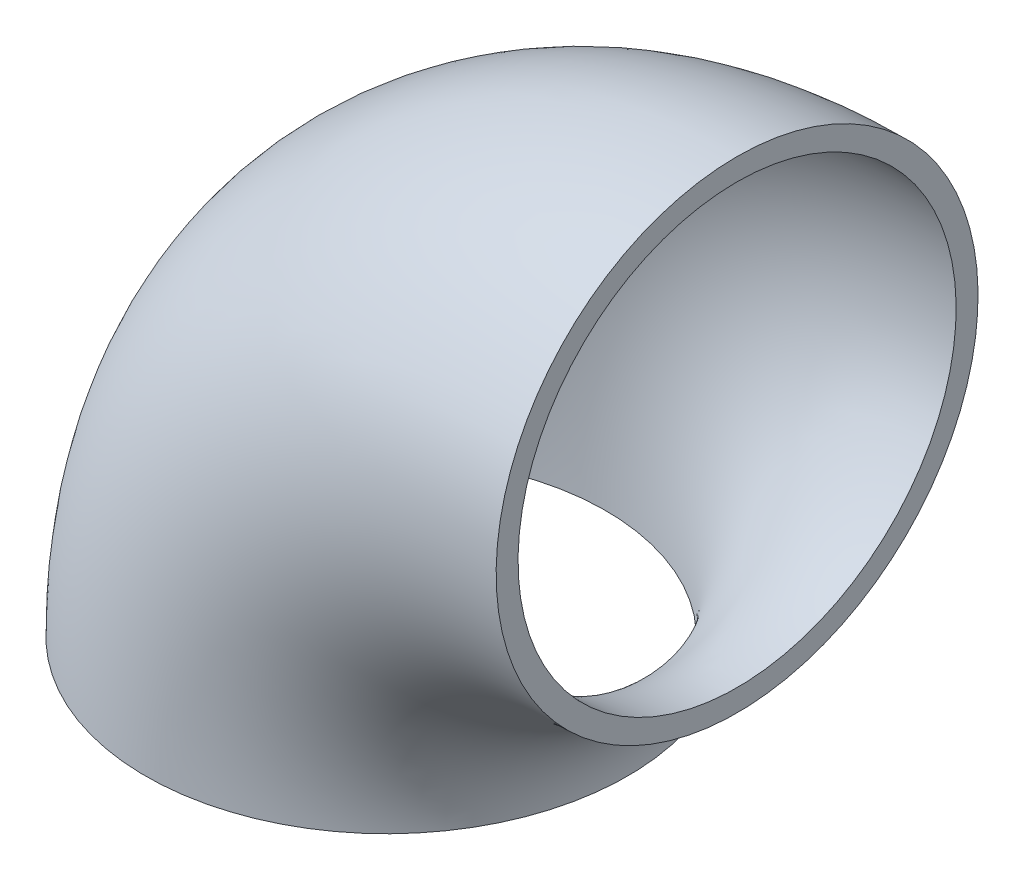
ISO-10303-21;
HEADER;
FILE_DESCRIPTION(('STEP AP214'),'2;1');
FILE_NAME('part.step','',(''),(''),'','','');
FILE_SCHEMA(('AUTOMOTIVE_DESIGN { 1 0 10303 214 1 1 1 1 }'));
ENDSEC;
DATA;
#1=APPLICATION_CONTEXT('core data for automotive mechanical design processes');
#2=APPLICATION_PROTOCOL_DEFINITION('international standard','automotive_design',2000,#1);
#3=PRODUCT_CONTEXT('',#1,'mechanical');
#4=PRODUCT('Part','Part','',(#3));
#5=PRODUCT_RELATED_PRODUCT_CATEGORY('part','',(#4));
#6=PRODUCT_DEFINITION_FORMATION('','',#4);
#7=PRODUCT_DEFINITION_CONTEXT('part definition',#1,'design');
#8=PRODUCT_DEFINITION('design','',#6,#7);
#9=PRODUCT_DEFINITION_SHAPE('','',#8);
#10=(LENGTH_UNIT() NAMED_UNIT(*) SI_UNIT(.MILLI.,.METRE.));
#11=(NAMED_UNIT(*) PLANE_ANGLE_UNIT() SI_UNIT($,.RADIAN.));
#12=(NAMED_UNIT(*) SI_UNIT($,.STERADIAN.) SOLID_ANGLE_UNIT());
#13=UNCERTAINTY_MEASURE_WITH_UNIT(LENGTH_MEASURE(1.E-05),#10,'distance_accuracy_value','');
#14=(GEOMETRIC_REPRESENTATION_CONTEXT(3) GLOBAL_UNCERTAINTY_ASSIGNED_CONTEXT((#13)) GLOBAL_UNIT_ASSIGNED_CONTEXT((#10,
#11,#12)) REPRESENTATION_CONTEXT('',''));
#15=CARTESIAN_POINT('',(0.,0.,0.));
#16=DIRECTION('',(0.,0.,1.));
#17=DIRECTION('',(1.,0.,0.));
#18=AXIS2_PLACEMENT_3D('',#15,#16,#17);
#19=CARTESIAN_POINT('',(40.,0.,0.));
#20=DIRECTION('',(0.,0.,1.));
#21=DIRECTION('',(1.,0.,0.));
#22=AXIS2_PLACEMENT_3D('',#19,#20,#21);
#23=TOROIDAL_SURFACE('',#22,40.,27.5);
#24=CARTESIAN_POINT('',(40.,40.,0.));
#25=DIRECTION('',(1.,0.,0.));
#26=DIRECTION('',(0.,0.,1.));
#27=AXIS2_PLACEMENT_3D('',#24,#25,#26);
#28=CIRCLE('',#27,27.5);
#29=CARTESIAN_POINT('',(40.,67.5,0.));
#30=VERTEX_POINT('',#29);
#31=EDGE_CURVE('E40',#30,#30,#28,.T.);
#32=CARTESIAN_POINT('',(0.,0.,0.));
#33=DIRECTION('',(0.,1.,0.));
#34=DIRECTION('',(0.,0.,1.));
#35=AXIS2_PLACEMENT_3D('',#32,#33,#34);
#36=CIRCLE('',#35,27.5);
#37=CARTESIAN_POINT('',(-27.5,0.,0.));
#38=VERTEX_POINT('',#37);
#39=EDGE_CURVE('E51',#38,#38,#36,.T.);
#40=CARTESIAN_POINT('',(40.,0.,0.));
#41=DIRECTION('',(0.,0.,1.));
#42=DIRECTION('',(1.,0.,0.));
#43=AXIS2_PLACEMENT_3D('',#40,#41,#42);
#44=CIRCLE('',#43,67.5);
#45=EDGE_CURVE('',#30,#38,#44,.T.);
#46=ORIENTED_EDGE('',*,*,#31,.F.);
#47=ORIENTED_EDGE('',*,*,#39,.T.);
#48=ORIENTED_EDGE('',*,*,#45,.T.);
#49=ORIENTED_EDGE('',*,*,#45,.F.);
#50=EDGE_LOOP('',(#46,#48,#47,#49));
#51=FACE_BOUND('',#50,.T.);
#52=ADVANCED_FACE('F37',(#51),#23,.T.);
#53=CARTESIAN_POINT('',(40.,40.,0.));
#54=DIRECTION('',(1.,0.,0.));
#55=DIRECTION('',(0.,0.,1.));
#56=AXIS2_PLACEMENT_3D('',#53,#54,#55);
#57=PLANE('',#56);
#58=CARTESIAN_POINT('',(40.,40.,0.));
#59=DIRECTION('',(1.,0.,0.));
#60=DIRECTION('',(0.,0.,1.));
#61=AXIS2_PLACEMENT_3D('',#58,#59,#60);
#62=CIRCLE('',#61,25.);
#63=CARTESIAN_POINT('',(40.,65.,0.));
#64=VERTEX_POINT('',#63);
#65=EDGE_CURVE('E45',#64,#64,#62,.F.);
#66=ORIENTED_EDGE('',*,*,#65,.T.);
#67=EDGE_LOOP('',(#66));
#68=FACE_BOUND('',#67,.T.);
#69=ORIENTED_EDGE('',*,*,#31,.T.);
#70=EDGE_LOOP('',(#69));
#71=FACE_BOUND('',#70,.T.);
#72=ADVANCED_FACE('F61',(#68,#71),#57,.T.);
#73=CARTESIAN_POINT('',(0.,0.,0.));
#74=DIRECTION('',(0.,1.,0.));
#75=DIRECTION('',(0.,0.,1.));
#76=AXIS2_PLACEMENT_3D('',#73,#74,#75);
#77=PLANE('',#76);
#78=CARTESIAN_POINT('',(0.,0.,0.));
#79=DIRECTION('',(0.,1.,0.));
#80=DIRECTION('',(0.,0.,1.));
#81=AXIS2_PLACEMENT_3D('',#78,#79,#80);
#82=CIRCLE('',#81,25.);
#83=CARTESIAN_POINT('',(-25.,0.,0.));
#84=VERTEX_POINT('',#83);
#85=EDGE_CURVE('E10',#84,#84,#82,.F.);
#86=ORIENTED_EDGE('',*,*,#85,.F.);
#87=EDGE_LOOP('',(#86));
#88=FACE_BOUND('',#87,.T.);
#89=ORIENTED_EDGE('',*,*,#39,.F.);
#90=EDGE_LOOP('',(#89));
#91=FACE_BOUND('',#90,.T.);
#92=ADVANCED_FACE('F67',(#88,#91),#77,.F.);
#93=CARTESIAN_POINT('',(40.,0.,0.));
#94=DIRECTION('',(0.,0.,1.));
#95=DIRECTION('',(1.,0.,0.));
#96=AXIS2_PLACEMENT_3D('',#93,#94,#95);
#97=TOROIDAL_SURFACE('',#96,40.,25.);
#98=CARTESIAN_POINT('',(40.,0.,0.));
#99=DIRECTION('',(0.,0.,1.));
#100=DIRECTION('',(1.,0.,0.));
#101=AXIS2_PLACEMENT_3D('',#98,#99,#100);
#102=CIRCLE('',#101,65.);
#103=EDGE_CURVE('',#64,#84,#102,.T.);
#104=ORIENTED_EDGE('',*,*,#65,.F.);
#105=ORIENTED_EDGE('',*,*,#85,.T.);
#106=ORIENTED_EDGE('',*,*,#103,.T.);
#107=ORIENTED_EDGE('',*,*,#103,.F.);
#108=EDGE_LOOP('',(#104,#106,#105,#107));
#109=FACE_BOUND('',#108,.T.);
#110=ADVANCED_FACE('F69',(#109),#97,.F.);
#111=CLOSED_SHELL('',(#52,#72,#92,#110));
#112=MANIFOLD_SOLID_BREP('B2',#111);
#113=ADVANCED_BREP_SHAPE_REPRESENTATION('',(#18,#112),#14);
#114=SHAPE_DEFINITION_REPRESENTATION(#9,#113);
ENDSEC;
END-ISO-10303-21;
